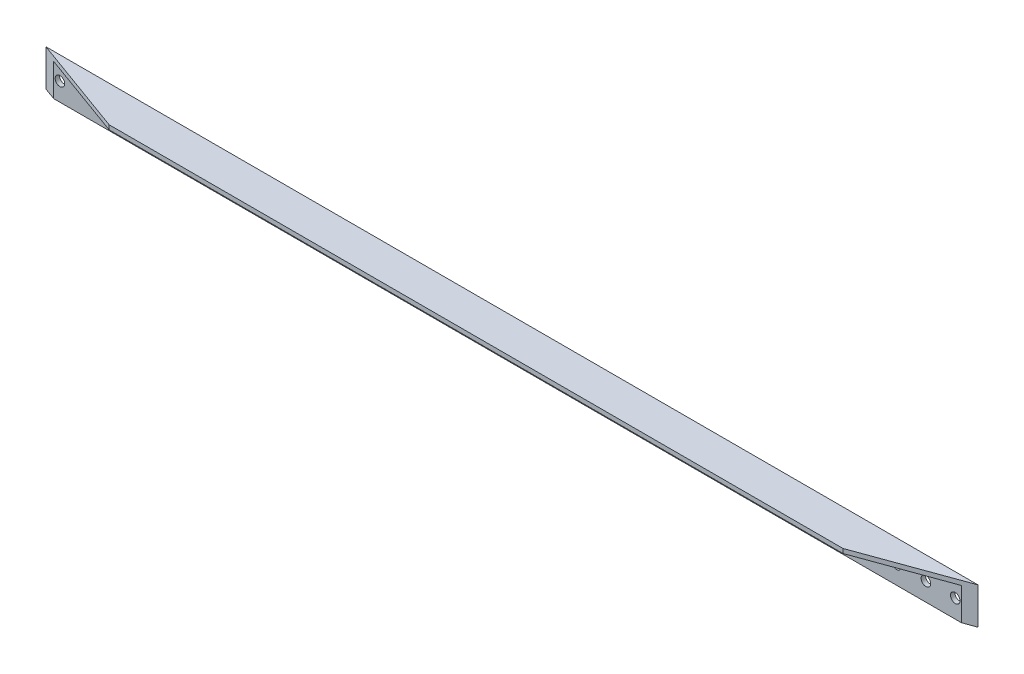
ISO-10303-21;
HEADER;
FILE_DESCRIPTION(('STEP AP214'),'2;1');
FILE_NAME('part.step','',(''),(''),'','','');
FILE_SCHEMA(('AUTOMOTIVE_DESIGN { 1 0 10303 214 1 1 1 1 }'));
ENDSEC;
DATA;
#1=APPLICATION_CONTEXT('core data for automotive mechanical design processes');
#2=APPLICATION_PROTOCOL_DEFINITION('international standard','automotive_design',2000,#1);
#3=PRODUCT_CONTEXT('',#1,'mechanical');
#4=PRODUCT('Part','Part','',(#3));
#5=PRODUCT_RELATED_PRODUCT_CATEGORY('part','',(#4));
#6=PRODUCT_DEFINITION_FORMATION('','',#4);
#7=PRODUCT_DEFINITION_CONTEXT('part definition',#1,'design');
#8=PRODUCT_DEFINITION('design','',#6,#7);
#9=PRODUCT_DEFINITION_SHAPE('','',#8);
#10=(LENGTH_UNIT() NAMED_UNIT(*) SI_UNIT(.MILLI.,.METRE.));
#11=(NAMED_UNIT(*) PLANE_ANGLE_UNIT() SI_UNIT($,.RADIAN.));
#12=(NAMED_UNIT(*) SI_UNIT($,.STERADIAN.) SOLID_ANGLE_UNIT());
#13=UNCERTAINTY_MEASURE_WITH_UNIT(LENGTH_MEASURE(1.E-05),#10,'distance_accuracy_value','');
#14=(GEOMETRIC_REPRESENTATION_CONTEXT(3) GLOBAL_UNCERTAINTY_ASSIGNED_CONTEXT((#13)) GLOBAL_UNIT_ASSIGNED_CONTEXT((#10,
#11,#12)) REPRESENTATION_CONTEXT('',''));
#15=CARTESIAN_POINT('',(0.,0.,0.));
#16=DIRECTION('',(0.,0.,1.));
#17=DIRECTION('',(1.,0.,0.));
#18=AXIS2_PLACEMENT_3D('',#15,#16,#17);
#19=CARTESIAN_POINT('',(-1270.,-50.,12.));
#20=DIRECTION('',(0.,0.,1.));
#21=DIRECTION('',(1.,0.,0.));
#22=AXIS2_PLACEMENT_3D('',#19,#20,#21);
#23=PLANE('',#22);
#24=DIRECTION('',(0.,1.,0.));
#25=VECTOR('',#24,1.);
#26=CARTESIAN_POINT('',(-1236.9387755102,-50.,12.));
#27=LINE('',#26,#25);
#28=CARTESIAN_POINT('',(-1236.9387755102,-50.,12.));
#29=VERTEX_POINT('',#28);
#30=CARTESIAN_POINT('',(-1236.9387755102,38.,12.));
#31=VERTEX_POINT('',#30);
#32=EDGE_CURVE('E249',#29,#31,#27,.T.);
#33=ORIENTED_EDGE('',*,*,#32,.F.);
#34=DIRECTION('',(1.,0.,0.));
#35=VECTOR('',#34,1.);
#36=CARTESIAN_POINT('',(-1270.,-50.,12.));
#37=LINE('',#36,#35);
#38=CARTESIAN_POINT('',(1236.9387755102,-50.,12.));
#39=VERTEX_POINT('',#38);
#40=EDGE_CURVE('E215',#29,#39,#37,.T.);
#41=ORIENTED_EDGE('',*,*,#40,.T.);
#42=DIRECTION('',(0.,-1.,0.));
#43=VECTOR('',#42,1.);
#44=CARTESIAN_POINT('',(1236.9387755102,-50.,12.));
#45=LINE('',#44,#43);
#46=CARTESIAN_POINT('',(1236.9387755102,38.,11.9999999999999));
#47=VERTEX_POINT('',#46);
#48=EDGE_CURVE('E233',#47,#39,#45,.T.);
#49=ORIENTED_EDGE('',*,*,#48,.F.);
#50=DIRECTION('',(1.,0.,0.));
#51=VECTOR('',#50,1.);
#52=CARTESIAN_POINT('',(-1270.,38.,12.));
#53=LINE('',#52,#51);
#54=EDGE_CURVE('E36',#31,#47,#53,.T.);
#55=ORIENTED_EDGE('',*,*,#54,.F.);
#56=EDGE_LOOP('',(#33,#41,#49,#55));
#57=FACE_BOUND('',#56,.T.);
#58=CARTESIAN_POINT('',(-1140.,0.,12.));
#59=DIRECTION('',(0.,0.,1.));
#60=DIRECTION('',(-1.,0.,0.));
#61=AXIS2_PLACEMENT_3D('',#58,#59,#60);
#62=CIRCLE('',#61,12.9999999999998);
#63=CARTESIAN_POINT('',(-1153.,0.,12.));
#64=VERTEX_POINT('',#63);
#65=EDGE_CURVE('E113',#64,#64,#62,.T.);
#66=ORIENTED_EDGE('',*,*,#65,.F.);
#67=EDGE_LOOP('',(#66));
#68=FACE_BOUND('',#67,.T.);
#69=CARTESIAN_POINT('',(-979.999999999999,0.,12.));
#70=DIRECTION('',(0.,0.,1.));
#71=DIRECTION('',(-1.,0.,0.));
#72=AXIS2_PLACEMENT_3D('',#69,#70,#71);
#73=CIRCLE('',#72,13.);
#74=CARTESIAN_POINT('',(-992.999999999999,0.,12.));
#75=VERTEX_POINT('',#74);
#76=EDGE_CURVE('E125',#75,#75,#73,.T.);
#77=ORIENTED_EDGE('',*,*,#76,.F.);
#78=EDGE_LOOP('',(#77));
#79=FACE_BOUND('',#78,.T.);
#80=CARTESIAN_POINT('',(-459.999999999999,0.,12.));
#81=DIRECTION('',(0.,0.,1.));
#82=DIRECTION('',(-1.,0.,0.));
#83=AXIS2_PLACEMENT_3D('',#80,#81,#82);
#84=CIRCLE('',#83,13.);
#85=CARTESIAN_POINT('',(-472.999999999999,0.,12.));
#86=VERTEX_POINT('',#85);
#87=EDGE_CURVE('E137',#86,#86,#84,.T.);
#88=ORIENTED_EDGE('',*,*,#87,.F.);
#89=EDGE_LOOP('',(#88));
#90=FACE_BOUND('',#89,.T.);
#91=CARTESIAN_POINT('',(-299.999999999999,0.,12.));
#92=DIRECTION('',(0.,0.,1.));
#93=DIRECTION('',(-1.,0.,0.));
#94=AXIS2_PLACEMENT_3D('',#91,#92,#93);
#95=CIRCLE('',#94,13.);
#96=CARTESIAN_POINT('',(-312.999999999999,0.,12.));
#97=VERTEX_POINT('',#96);
#98=EDGE_CURVE('E149',#97,#97,#95,.T.);
#99=ORIENTED_EDGE('',*,*,#98,.F.);
#100=EDGE_LOOP('',(#99));
#101=FACE_BOUND('',#100,.T.);
#102=CARTESIAN_POINT('',(179.999999999999,0.,12.));
#103=DIRECTION('',(0.,0.,1.));
#104=DIRECTION('',(1.,0.,0.));
#105=AXIS2_PLACEMENT_3D('',#102,#103,#104);
#106=CIRCLE('',#105,13.);
#107=CARTESIAN_POINT('',(192.999999999999,0.,12.));
#108=VERTEX_POINT('',#107);
#109=EDGE_CURVE('E161',#108,#108,#106,.T.);
#110=ORIENTED_EDGE('',*,*,#109,.F.);
#111=EDGE_LOOP('',(#110));
#112=FACE_BOUND('',#111,.T.);
#113=CARTESIAN_POINT('',(379.999999999999,0.,12.));
#114=DIRECTION('',(0.,0.,1.));
#115=DIRECTION('',(1.,0.,0.));
#116=AXIS2_PLACEMENT_3D('',#113,#114,#115);
#117=CIRCLE('',#116,13.);
#118=CARTESIAN_POINT('',(392.999999999999,0.,12.));
#119=VERTEX_POINT('',#118);
#120=EDGE_CURVE('E173',#119,#119,#117,.T.);
#121=ORIENTED_EDGE('',*,*,#120,.F.);
#122=EDGE_LOOP('',(#121));
#123=FACE_BOUND('',#122,.T.);
#124=CARTESIAN_POINT('',(579.999999999999,0.,12.));
#125=DIRECTION('',(0.,0.,1.));
#126=DIRECTION('',(1.,0.,0.));
#127=AXIS2_PLACEMENT_3D('',#124,#125,#126);
#128=CIRCLE('',#127,13.);
#129=CARTESIAN_POINT('',(592.999999999999,0.,12.));
#130=VERTEX_POINT('',#129);
#131=EDGE_CURVE('E185',#130,#130,#128,.T.);
#132=ORIENTED_EDGE('',*,*,#131,.F.);
#133=EDGE_LOOP('',(#132));
#134=FACE_BOUND('',#133,.T.);
#135=CARTESIAN_POINT('',(1060.,0.,12.));
#136=DIRECTION('',(0.,0.,1.));
#137=DIRECTION('',(1.,0.,0.));
#138=AXIS2_PLACEMENT_3D('',#135,#136,#137);
#139=CIRCLE('',#138,12.9999999999998);
#140=CARTESIAN_POINT('',(1073.,0.,12.));
#141=VERTEX_POINT('',#140);
#142=EDGE_CURVE('E197',#141,#141,#139,.T.);
#143=ORIENTED_EDGE('',*,*,#142,.F.);
#144=EDGE_LOOP('',(#143));
#145=FACE_BOUND('',#144,.T.);
#146=CARTESIAN_POINT('',(1220.,0.,12.));
#147=DIRECTION('',(0.,0.,1.));
#148=DIRECTION('',(1.,0.,0.));
#149=AXIS2_PLACEMENT_3D('',#146,#147,#148);
#150=CIRCLE('',#149,12.9999999999998);
#151=CARTESIAN_POINT('',(1233.,0.,12.));
#152=VERTEX_POINT('',#151);
#153=EDGE_CURVE('E209',#152,#152,#150,.T.);
#154=ORIENTED_EDGE('',*,*,#153,.F.);
#155=EDGE_LOOP('',(#154));
#156=FACE_BOUND('',#155,.T.);
#157=CARTESIAN_POINT('',(1140.,0.,12.));
#158=DIRECTION('',(0.,0.,1.));
#159=DIRECTION('',(1.,0.,0.));
#160=AXIS2_PLACEMENT_3D('',#157,#158,#159);
#161=CIRCLE('',#160,12.9999999999998);
#162=CARTESIAN_POINT('',(1153.,0.,12.));
#163=VERTEX_POINT('',#162);
#164=EDGE_CURVE('E203',#163,#163,#161,.T.);
#165=ORIENTED_EDGE('',*,*,#164,.F.);
#166=EDGE_LOOP('',(#165));
#167=FACE_BOUND('',#166,.T.);
#168=CARTESIAN_POINT('',(979.999999999999,0.,12.));
#169=DIRECTION('',(0.,0.,1.));
#170=DIRECTION('',(1.,0.,0.));
#171=AXIS2_PLACEMENT_3D('',#168,#169,#170);
#172=CIRCLE('',#171,13.);
#173=CARTESIAN_POINT('',(992.999999999999,0.,12.));
#174=VERTEX_POINT('',#173);
#175=EDGE_CURVE('E191',#174,#174,#172,.T.);
#176=ORIENTED_EDGE('',*,*,#175,.F.);
#177=EDGE_LOOP('',(#176));
#178=FACE_BOUND('',#177,.T.);
#179=CARTESIAN_POINT('',(459.999999999999,0.,12.));
#180=DIRECTION('',(0.,0.,1.));
#181=DIRECTION('',(1.,0.,0.));
#182=AXIS2_PLACEMENT_3D('',#179,#180,#181);
#183=CIRCLE('',#182,13.);
#184=CARTESIAN_POINT('',(472.999999999999,0.,12.));
#185=VERTEX_POINT('',#184);
#186=EDGE_CURVE('E179',#185,#185,#183,.T.);
#187=ORIENTED_EDGE('',*,*,#186,.F.);
#188=EDGE_LOOP('',(#187));
#189=FACE_BOUND('',#188,.T.);
#190=CARTESIAN_POINT('',(299.999999999999,0.,12.));
#191=DIRECTION('',(0.,0.,1.));
#192=DIRECTION('',(1.,0.,0.));
#193=AXIS2_PLACEMENT_3D('',#190,#191,#192);
#194=CIRCLE('',#193,13.);
#195=CARTESIAN_POINT('',(312.999999999999,0.,12.));
#196=VERTEX_POINT('',#195);
#197=EDGE_CURVE('E167',#196,#196,#194,.T.);
#198=ORIENTED_EDGE('',*,*,#197,.F.);
#199=EDGE_LOOP('',(#198));
#200=FACE_BOUND('',#199,.T.);
#201=CARTESIAN_POINT('',(-179.999999999999,0.,12.));
#202=DIRECTION('',(0.,0.,1.));
#203=DIRECTION('',(-1.,0.,0.));
#204=AXIS2_PLACEMENT_3D('',#201,#202,#203);
#205=CIRCLE('',#204,13.);
#206=CARTESIAN_POINT('',(-192.999999999999,0.,12.));
#207=VERTEX_POINT('',#206);
#208=EDGE_CURVE('E155',#207,#207,#205,.T.);
#209=ORIENTED_EDGE('',*,*,#208,.F.);
#210=EDGE_LOOP('',(#209));
#211=FACE_BOUND('',#210,.T.);
#212=CARTESIAN_POINT('',(-379.999999999999,0.,12.));
#213=DIRECTION('',(0.,0.,1.));
#214=DIRECTION('',(-1.,0.,0.));
#215=AXIS2_PLACEMENT_3D('',#212,#213,#214);
#216=CIRCLE('',#215,13.);
#217=CARTESIAN_POINT('',(-392.999999999999,0.,12.));
#218=VERTEX_POINT('',#217);
#219=EDGE_CURVE('E143',#218,#218,#216,.T.);
#220=ORIENTED_EDGE('',*,*,#219,.F.);
#221=EDGE_LOOP('',(#220));
#222=FACE_BOUND('',#221,.T.);
#223=CARTESIAN_POINT('',(-579.999999999999,0.,12.));
#224=DIRECTION('',(0.,0.,1.));
#225=DIRECTION('',(-1.,0.,0.));
#226=AXIS2_PLACEMENT_3D('',#223,#224,#225);
#227=CIRCLE('',#226,13.);
#228=CARTESIAN_POINT('',(-592.999999999999,0.,12.));
#229=VERTEX_POINT('',#228);
#230=EDGE_CURVE('E131',#229,#229,#227,.T.);
#231=ORIENTED_EDGE('',*,*,#230,.F.);
#232=EDGE_LOOP('',(#231));
#233=FACE_BOUND('',#232,.T.);
#234=CARTESIAN_POINT('',(-1060.,0.,12.));
#235=DIRECTION('',(0.,0.,1.));
#236=DIRECTION('',(-1.,0.,0.));
#237=AXIS2_PLACEMENT_3D('',#234,#235,#236);
#238=CIRCLE('',#237,12.9999999999998);
#239=CARTESIAN_POINT('',(-1073.,0.,12.));
#240=VERTEX_POINT('',#239);
#241=EDGE_CURVE('E119',#240,#240,#238,.T.);
#242=ORIENTED_EDGE('',*,*,#241,.F.);
#243=EDGE_LOOP('',(#242));
#244=FACE_BOUND('',#243,.T.);
#245=CARTESIAN_POINT('',(-1220.,0.,12.));
#246=DIRECTION('',(0.,0.,1.));
#247=DIRECTION('',(-1.,0.,0.));
#248=AXIS2_PLACEMENT_3D('',#245,#246,#247);
#249=CIRCLE('',#248,12.9999999999998);
#250=CARTESIAN_POINT('',(-1233.,0.,12.));
#251=VERTEX_POINT('',#250);
#252=EDGE_CURVE('E104',#251,#251,#249,.T.);
#253=ORIENTED_EDGE('',*,*,#252,.F.);
#254=EDGE_LOOP('',(#253));
#255=FACE_BOUND('',#254,.T.);
#256=ADVANCED_FACE('F32',(#57,#68,#79,#90,#101,#112,#123,#134,#145,#156,#167,#178,#189,#200,
#211,#222,#233,#244,#255),#23,.T.);
#257=CARTESIAN_POINT('',(-1270.,-50.,0.));
#258=DIRECTION('',(0.,0.,1.));
#259=DIRECTION('',(1.,0.,0.));
#260=AXIS2_PLACEMENT_3D('',#257,#258,#259);
#261=PLANE('',#260);
#262=CARTESIAN_POINT('',(-1140.,0.,0.));
#263=DIRECTION('',(0.,0.,1.));
#264=DIRECTION('',(-1.,0.,0.));
#265=AXIS2_PLACEMENT_3D('',#262,#263,#264);
#266=CIRCLE('',#265,12.9999999999998);
#267=CARTESIAN_POINT('',(-1153.,0.,0.));
#268=VERTEX_POINT('',#267);
#269=EDGE_CURVE('E111',#268,#268,#266,.T.);
#270=ORIENTED_EDGE('',*,*,#269,.T.);
#271=EDGE_LOOP('',(#270));
#272=FACE_BOUND('',#271,.T.);
#273=CARTESIAN_POINT('',(-979.999999999999,0.,0.));
#274=DIRECTION('',(0.,0.,1.));
#275=DIRECTION('',(-1.,0.,0.));
#276=AXIS2_PLACEMENT_3D('',#273,#274,#275);
#277=CIRCLE('',#276,13.);
#278=CARTESIAN_POINT('',(-992.999999999999,0.,0.));
#279=VERTEX_POINT('',#278);
#280=EDGE_CURVE('E122',#279,#279,#277,.T.);
#281=ORIENTED_EDGE('',*,*,#280,.T.);
#282=EDGE_LOOP('',(#281));
#283=FACE_BOUND('',#282,.T.);
#284=CARTESIAN_POINT('',(-459.999999999999,0.,0.));
#285=DIRECTION('',(0.,0.,1.));
#286=DIRECTION('',(-1.,0.,0.));
#287=AXIS2_PLACEMENT_3D('',#284,#285,#286);
#288=CIRCLE('',#287,13.);
#289=CARTESIAN_POINT('',(-472.999999999999,0.,0.));
#290=VERTEX_POINT('',#289);
#291=EDGE_CURVE('E134',#290,#290,#288,.T.);
#292=ORIENTED_EDGE('',*,*,#291,.T.);
#293=EDGE_LOOP('',(#292));
#294=FACE_BOUND('',#293,.T.);
#295=CARTESIAN_POINT('',(-299.999999999999,0.,0.));
#296=DIRECTION('',(0.,0.,1.));
#297=DIRECTION('',(-1.,0.,0.));
#298=AXIS2_PLACEMENT_3D('',#295,#296,#297);
#299=CIRCLE('',#298,13.);
#300=CARTESIAN_POINT('',(-312.999999999999,0.,0.));
#301=VERTEX_POINT('',#300);
#302=EDGE_CURVE('E146',#301,#301,#299,.T.);
#303=ORIENTED_EDGE('',*,*,#302,.T.);
#304=EDGE_LOOP('',(#303));
#305=FACE_BOUND('',#304,.T.);
#306=CARTESIAN_POINT('',(179.999999999999,0.,0.));
#307=DIRECTION('',(0.,0.,1.));
#308=DIRECTION('',(1.,0.,0.));
#309=AXIS2_PLACEMENT_3D('',#306,#307,#308);
#310=CIRCLE('',#309,13.);
#311=CARTESIAN_POINT('',(192.999999999999,0.,0.));
#312=VERTEX_POINT('',#311);
#313=EDGE_CURVE('E158',#312,#312,#310,.T.);
#314=ORIENTED_EDGE('',*,*,#313,.T.);
#315=EDGE_LOOP('',(#314));
#316=FACE_BOUND('',#315,.T.);
#317=CARTESIAN_POINT('',(379.999999999999,0.,0.));
#318=DIRECTION('',(0.,0.,1.));
#319=DIRECTION('',(1.,0.,0.));
#320=AXIS2_PLACEMENT_3D('',#317,#318,#319);
#321=CIRCLE('',#320,13.);
#322=CARTESIAN_POINT('',(392.999999999999,0.,0.));
#323=VERTEX_POINT('',#322);
#324=EDGE_CURVE('E170',#323,#323,#321,.T.);
#325=ORIENTED_EDGE('',*,*,#324,.T.);
#326=EDGE_LOOP('',(#325));
#327=FACE_BOUND('',#326,.T.);
#328=CARTESIAN_POINT('',(579.999999999999,0.,0.));
#329=DIRECTION('',(0.,0.,1.));
#330=DIRECTION('',(1.,0.,0.));
#331=AXIS2_PLACEMENT_3D('',#328,#329,#330);
#332=CIRCLE('',#331,13.);
#333=CARTESIAN_POINT('',(592.999999999999,0.,0.));
#334=VERTEX_POINT('',#333);
#335=EDGE_CURVE('E182',#334,#334,#332,.T.);
#336=ORIENTED_EDGE('',*,*,#335,.T.);
#337=EDGE_LOOP('',(#336));
#338=FACE_BOUND('',#337,.T.);
#339=CARTESIAN_POINT('',(1060.,0.,0.));
#340=DIRECTION('',(0.,0.,1.));
#341=DIRECTION('',(1.,0.,0.));
#342=AXIS2_PLACEMENT_3D('',#339,#340,#341);
#343=CIRCLE('',#342,12.9999999999998);
#344=CARTESIAN_POINT('',(1073.,0.,0.));
#345=VERTEX_POINT('',#344);
#346=EDGE_CURVE('E194',#345,#345,#343,.T.);
#347=ORIENTED_EDGE('',*,*,#346,.T.);
#348=EDGE_LOOP('',(#347));
#349=FACE_BOUND('',#348,.T.);
#350=CARTESIAN_POINT('',(1220.,0.,0.));
#351=DIRECTION('',(0.,0.,1.));
#352=DIRECTION('',(1.,0.,0.));
#353=AXIS2_PLACEMENT_3D('',#350,#351,#352);
#354=CIRCLE('',#353,12.9999999999998);
#355=CARTESIAN_POINT('',(1233.,0.,0.));
#356=VERTEX_POINT('',#355);
#357=EDGE_CURVE('E206',#356,#356,#354,.T.);
#358=ORIENTED_EDGE('',*,*,#357,.T.);
#359=EDGE_LOOP('',(#358));
#360=FACE_BOUND('',#359,.T.);
#361=DIRECTION('',(0.,-1.,0.));
#362=VECTOR('',#361,1.);
#363=CARTESIAN_POINT('',(-1270.,50.,0.));
#364=LINE('',#363,#362);
#365=CARTESIAN_POINT('',(-1270.,50.,0.));
#366=VERTEX_POINT('',#365);
#367=CARTESIAN_POINT('',(-1270.,-50.,0.));
#368=VERTEX_POINT('',#367);
#369=EDGE_CURVE('E212',#366,#368,#364,.T.);
#370=ORIENTED_EDGE('',*,*,#369,.F.);
#371=DIRECTION('',(-1.,0.,0.));
#372=VECTOR('',#371,1.);
#373=CARTESIAN_POINT('',(-1270.,50.,0.));
#374=LINE('',#373,#372);
#375=CARTESIAN_POINT('',(1270.,50.,0.));
#376=VERTEX_POINT('',#375);
#377=EDGE_CURVE('E96',#376,#366,#374,.T.);
#378=ORIENTED_EDGE('',*,*,#377,.F.);
#379=DIRECTION('',(0.,1.,0.));
#380=VECTOR('',#379,1.);
#381=CARTESIAN_POINT('',(1270.,50.,0.));
#382=LINE('',#381,#380);
#383=CARTESIAN_POINT('',(1270.,-50.,0.));
#384=VERTEX_POINT('',#383);
#385=EDGE_CURVE('E221',#384,#376,#382,.T.);
#386=ORIENTED_EDGE('',*,*,#385,.F.);
#387=DIRECTION('',(1.,0.,0.));
#388=VECTOR('',#387,1.);
#389=CARTESIAN_POINT('',(-1270.,-50.,0.));
#390=LINE('',#389,#388);
#391=EDGE_CURVE('E218',#368,#384,#390,.T.);
#392=ORIENTED_EDGE('',*,*,#391,.F.);
#393=EDGE_LOOP('',(#370,#378,#386,#392));
#394=FACE_BOUND('',#393,.T.);
#395=CARTESIAN_POINT('',(1140.,0.,0.));
#396=DIRECTION('',(0.,0.,1.));
#397=DIRECTION('',(1.,0.,0.));
#398=AXIS2_PLACEMENT_3D('',#395,#396,#397);
#399=CIRCLE('',#398,12.9999999999998);
#400=CARTESIAN_POINT('',(1153.,0.,0.));
#401=VERTEX_POINT('',#400);
#402=EDGE_CURVE('E200',#401,#401,#399,.T.);
#403=ORIENTED_EDGE('',*,*,#402,.T.);
#404=EDGE_LOOP('',(#403));
#405=FACE_BOUND('',#404,.T.);
#406=CARTESIAN_POINT('',(979.999999999999,0.,0.));
#407=DIRECTION('',(0.,0.,1.));
#408=DIRECTION('',(1.,0.,0.));
#409=AXIS2_PLACEMENT_3D('',#406,#407,#408);
#410=CIRCLE('',#409,13.);
#411=CARTESIAN_POINT('',(992.999999999999,0.,0.));
#412=VERTEX_POINT('',#411);
#413=EDGE_CURVE('E188',#412,#412,#410,.T.);
#414=ORIENTED_EDGE('',*,*,#413,.T.);
#415=EDGE_LOOP('',(#414));
#416=FACE_BOUND('',#415,.T.);
#417=CARTESIAN_POINT('',(459.999999999999,0.,0.));
#418=DIRECTION('',(0.,0.,1.));
#419=DIRECTION('',(1.,0.,0.));
#420=AXIS2_PLACEMENT_3D('',#417,#418,#419);
#421=CIRCLE('',#420,13.);
#422=CARTESIAN_POINT('',(472.999999999999,0.,0.));
#423=VERTEX_POINT('',#422);
#424=EDGE_CURVE('E176',#423,#423,#421,.T.);
#425=ORIENTED_EDGE('',*,*,#424,.T.);
#426=EDGE_LOOP('',(#425));
#427=FACE_BOUND('',#426,.T.);
#428=CARTESIAN_POINT('',(299.999999999999,0.,0.));
#429=DIRECTION('',(0.,0.,1.));
#430=DIRECTION('',(1.,0.,0.));
#431=AXIS2_PLACEMENT_3D('',#428,#429,#430);
#432=CIRCLE('',#431,13.);
#433=CARTESIAN_POINT('',(312.999999999999,0.,0.));
#434=VERTEX_POINT('',#433);
#435=EDGE_CURVE('E164',#434,#434,#432,.T.);
#436=ORIENTED_EDGE('',*,*,#435,.T.);
#437=EDGE_LOOP('',(#436));
#438=FACE_BOUND('',#437,.T.);
#439=CARTESIAN_POINT('',(-179.999999999999,0.,0.));
#440=DIRECTION('',(0.,0.,1.));
#441=DIRECTION('',(-1.,0.,0.));
#442=AXIS2_PLACEMENT_3D('',#439,#440,#441);
#443=CIRCLE('',#442,13.);
#444=CARTESIAN_POINT('',(-192.999999999999,0.,0.));
#445=VERTEX_POINT('',#444);
#446=EDGE_CURVE('E152',#445,#445,#443,.T.);
#447=ORIENTED_EDGE('',*,*,#446,.T.);
#448=EDGE_LOOP('',(#447));
#449=FACE_BOUND('',#448,.T.);
#450=CARTESIAN_POINT('',(-379.999999999999,0.,0.));
#451=DIRECTION('',(0.,0.,1.));
#452=DIRECTION('',(-1.,0.,0.));
#453=AXIS2_PLACEMENT_3D('',#450,#451,#452);
#454=CIRCLE('',#453,13.);
#455=CARTESIAN_POINT('',(-392.999999999999,0.,0.));
#456=VERTEX_POINT('',#455);
#457=EDGE_CURVE('E140',#456,#456,#454,.T.);
#458=ORIENTED_EDGE('',*,*,#457,.T.);
#459=EDGE_LOOP('',(#458));
#460=FACE_BOUND('',#459,.T.);
#461=CARTESIAN_POINT('',(-579.999999999999,0.,0.));
#462=DIRECTION('',(0.,0.,1.));
#463=DIRECTION('',(-1.,0.,0.));
#464=AXIS2_PLACEMENT_3D('',#461,#462,#463);
#465=CIRCLE('',#464,13.);
#466=CARTESIAN_POINT('',(-592.999999999999,0.,0.));
#467=VERTEX_POINT('',#466);
#468=EDGE_CURVE('E128',#467,#467,#465,.T.);
#469=ORIENTED_EDGE('',*,*,#468,.T.);
#470=EDGE_LOOP('',(#469));
#471=FACE_BOUND('',#470,.T.);
#472=CARTESIAN_POINT('',(-1060.,0.,0.));
#473=DIRECTION('',(0.,0.,1.));
#474=DIRECTION('',(-1.,0.,0.));
#475=AXIS2_PLACEMENT_3D('',#472,#473,#474);
#476=CIRCLE('',#475,12.9999999999998);
#477=CARTESIAN_POINT('',(-1073.,0.,0.));
#478=VERTEX_POINT('',#477);
#479=EDGE_CURVE('E116',#478,#478,#476,.T.);
#480=ORIENTED_EDGE('',*,*,#479,.T.);
#481=EDGE_LOOP('',(#480));
#482=FACE_BOUND('',#481,.T.);
#483=CARTESIAN_POINT('',(-1220.,0.,0.));
#484=DIRECTION('',(0.,0.,1.));
#485=DIRECTION('',(-1.,0.,0.));
#486=AXIS2_PLACEMENT_3D('',#483,#484,#485);
#487=CIRCLE('',#486,12.9999999999998);
#488=CARTESIAN_POINT('',(-1233.,0.,0.));
#489=VERTEX_POINT('',#488);
#490=EDGE_CURVE('E100',#489,#489,#487,.T.);
#491=ORIENTED_EDGE('',*,*,#490,.T.);
#492=EDGE_LOOP('',(#491));
#493=FACE_BOUND('',#492,.T.);
#494=ADVANCED_FACE('F253',(#272,#283,#294,#305,#316,#327,#338,#349,#360,#394,#405,#416,#427,
#438,#449,#460,#471,#482,#493),#261,.F.);
#495=CARTESIAN_POINT('',(-1270.,-50.,12.));
#496=DIRECTION('',(0.,1.,0.));
#497=DIRECTION('',(0.,0.,1.));
#498=AXIS2_PLACEMENT_3D('',#495,#496,#497);
#499=PLANE('',#498);
#500=ORIENTED_EDGE('',*,*,#40,.F.);
#501=DIRECTION('',(-0.939996554641713,0.,-0.341183934647733));
#502=VECTOR('',#501,1.);
#503=CARTESIAN_POINT('',(-1266.15145932318,-50.,1.39687772714057));
#504=LINE('',#503,#502);
#505=EDGE_CURVE('E237',#29,#368,#504,.T.);
#506=ORIENTED_EDGE('',*,*,#505,.T.);
#507=ORIENTED_EDGE('',*,*,#391,.T.);
#508=DIRECTION('',(-0.939996554641713,0.,0.341183934647733));
#509=VECTOR('',#508,1.);
#510=CARTESIAN_POINT('',(-978.176088432076,-50.,816.004654319791));
#511=LINE('',#510,#509);
#512=EDGE_CURVE('E235',#384,#39,#511,.T.);
#513=ORIENTED_EDGE('',*,*,#512,.T.);
#514=EDGE_LOOP('',(#500,#506,#507,#513));
#515=FACE_BOUND('',#514,.T.);
#516=ADVANCED_FACE('F34',(#515),#499,.F.);
#517=CARTESIAN_POINT('',(-1270.,50.,12.));
#518=DIRECTION('',(0.,-1.,0.));
#519=DIRECTION('',(0.,0.,-1.));
#520=AXIS2_PLACEMENT_3D('',#517,#518,#519);
#521=PLANE('',#520);
#522=ORIENTED_EDGE('',*,*,#377,.T.);
#523=DIRECTION('',(-0.939996554641713,0.,-0.341183934647733));
#524=VECTOR('',#523,1.);
#525=CARTESIAN_POINT('',(-1270.,50.,0.));
#526=LINE('',#525,#524);
#527=CARTESIAN_POINT('',(-1000.,50.,98.));
#528=VERTEX_POINT('',#527);
#529=EDGE_CURVE('E86',#528,#366,#526,.T.);
#530=ORIENTED_EDGE('',*,*,#529,.F.);
#531=DIRECTION('',(-1.,0.,0.));
#532=VECTOR('',#531,1.);
#533=CARTESIAN_POINT('',(-1270.,50.,98.));
#534=LINE('',#533,#532);
#535=CARTESIAN_POINT('',(999.999999999999,50.,98.));
#536=VERTEX_POINT('',#535);
#537=EDGE_CURVE('E94',#536,#528,#534,.T.);
#538=ORIENTED_EDGE('',*,*,#537,.F.);
#539=DIRECTION('',(-0.939996554641713,0.,0.341183934647733));
#540=VECTOR('',#539,1.);
#541=CARTESIAN_POINT('',(1270.,50.,0.));
#542=LINE('',#541,#540);
#543=EDGE_CURVE('E56',#376,#536,#542,.T.);
#544=ORIENTED_EDGE('',*,*,#543,.F.);
#545=EDGE_LOOP('',(#522,#530,#538,#544));
#546=FACE_BOUND('',#545,.T.);
#547=ADVANCED_FACE('F93',(#546),#521,.F.);
#548=CARTESIAN_POINT('',(1220.,0.,12.));
#549=DIRECTION('',(0.,0.,-1.));
#550=DIRECTION('',(-1.,0.,0.));
#551=AXIS2_PLACEMENT_3D('',#548,#549,#550);
#552=CYLINDRICAL_SURFACE('',#551,12.9999999999998);
#553=ORIENTED_EDGE('',*,*,#153,.T.);
#554=EDGE_LOOP('',(#553));
#555=FACE_BOUND('',#554,.T.);
#556=ORIENTED_EDGE('',*,*,#357,.F.);
#557=EDGE_LOOP('',(#556));
#558=FACE_BOUND('',#557,.T.);
#559=ADVANCED_FACE('F294',(#555,#558),#552,.F.);
#560=CARTESIAN_POINT('',(1140.,0.,12.));
#561=DIRECTION('',(0.,0.,-1.));
#562=DIRECTION('',(-1.,0.,0.));
#563=AXIS2_PLACEMENT_3D('',#560,#561,#562);
#564=CYLINDRICAL_SURFACE('',#563,12.9999999999998);
#565=ORIENTED_EDGE('',*,*,#164,.T.);
#566=EDGE_LOOP('',(#565));
#567=FACE_BOUND('',#566,.T.);
#568=ORIENTED_EDGE('',*,*,#402,.F.);
#569=EDGE_LOOP('',(#568));
#570=FACE_BOUND('',#569,.T.);
#571=ADVANCED_FACE('F301',(#567,#570),#564,.F.);
#572=CARTESIAN_POINT('',(1060.,0.,12.));
#573=DIRECTION('',(0.,0.,-1.));
#574=DIRECTION('',(-1.,0.,0.));
#575=AXIS2_PLACEMENT_3D('',#572,#573,#574);
#576=CYLINDRICAL_SURFACE('',#575,12.9999999999998);
#577=ORIENTED_EDGE('',*,*,#142,.T.);
#578=EDGE_LOOP('',(#577));
#579=FACE_BOUND('',#578,.T.);
#580=ORIENTED_EDGE('',*,*,#346,.F.);
#581=EDGE_LOOP('',(#580));
#582=FACE_BOUND('',#581,.T.);
#583=ADVANCED_FACE('F453',(#579,#582),#576,.F.);
#584=CARTESIAN_POINT('',(979.999999999999,0.,12.));
#585=DIRECTION('',(0.,0.,-1.));
#586=DIRECTION('',(-1.,0.,0.));
#587=AXIS2_PLACEMENT_3D('',#584,#585,#586);
#588=CYLINDRICAL_SURFACE('',#587,13.);
#589=ORIENTED_EDGE('',*,*,#175,.T.);
#590=EDGE_LOOP('',(#589));
#591=FACE_BOUND('',#590,.T.);
#592=ORIENTED_EDGE('',*,*,#413,.F.);
#593=EDGE_LOOP('',(#592));
#594=FACE_BOUND('',#593,.T.);
#595=ADVANCED_FACE('F443',(#591,#594),#588,.F.);
#596=CARTESIAN_POINT('',(579.999999999999,0.,12.));
#597=DIRECTION('',(0.,0.,-1.));
#598=DIRECTION('',(-1.,0.,0.));
#599=AXIS2_PLACEMENT_3D('',#596,#597,#598);
#600=CYLINDRICAL_SURFACE('',#599,13.);
#601=ORIENTED_EDGE('',*,*,#131,.T.);
#602=EDGE_LOOP('',(#601));
#603=FACE_BOUND('',#602,.T.);
#604=ORIENTED_EDGE('',*,*,#335,.F.);
#605=EDGE_LOOP('',(#604));
#606=FACE_BOUND('',#605,.T.);
#607=ADVANCED_FACE('F433',(#603,#606),#600,.F.);
#608=CARTESIAN_POINT('',(459.999999999999,0.,12.));
#609=DIRECTION('',(0.,0.,-1.));
#610=DIRECTION('',(-1.,0.,0.));
#611=AXIS2_PLACEMENT_3D('',#608,#609,#610);
#612=CYLINDRICAL_SURFACE('',#611,13.);
#613=ORIENTED_EDGE('',*,*,#186,.T.);
#614=EDGE_LOOP('',(#613));
#615=FACE_BOUND('',#614,.T.);
#616=ORIENTED_EDGE('',*,*,#424,.F.);
#617=EDGE_LOOP('',(#616));
#618=FACE_BOUND('',#617,.T.);
#619=ADVANCED_FACE('F423',(#615,#618),#612,.F.);
#620=CARTESIAN_POINT('',(379.999999999999,0.,12.));
#621=DIRECTION('',(0.,0.,-1.));
#622=DIRECTION('',(-1.,0.,0.));
#623=AXIS2_PLACEMENT_3D('',#620,#621,#622);
#624=CYLINDRICAL_SURFACE('',#623,13.);
#625=ORIENTED_EDGE('',*,*,#120,.T.);
#626=EDGE_LOOP('',(#625));
#627=FACE_BOUND('',#626,.T.);
#628=ORIENTED_EDGE('',*,*,#324,.F.);
#629=EDGE_LOOP('',(#628));
#630=FACE_BOUND('',#629,.T.);
#631=ADVANCED_FACE('F413',(#627,#630),#624,.F.);
#632=CARTESIAN_POINT('',(299.999999999999,0.,12.));
#633=DIRECTION('',(0.,0.,-1.));
#634=DIRECTION('',(-1.,0.,0.));
#635=AXIS2_PLACEMENT_3D('',#632,#633,#634);
#636=CYLINDRICAL_SURFACE('',#635,13.);
#637=ORIENTED_EDGE('',*,*,#197,.T.);
#638=EDGE_LOOP('',(#637));
#639=FACE_BOUND('',#638,.T.);
#640=ORIENTED_EDGE('',*,*,#435,.F.);
#641=EDGE_LOOP('',(#640));
#642=FACE_BOUND('',#641,.T.);
#643=ADVANCED_FACE('F403',(#639,#642),#636,.F.);
#644=CARTESIAN_POINT('',(179.999999999999,0.,12.));
#645=DIRECTION('',(0.,0.,-1.));
#646=DIRECTION('',(-1.,0.,0.));
#647=AXIS2_PLACEMENT_3D('',#644,#645,#646);
#648=CYLINDRICAL_SURFACE('',#647,13.);
#649=ORIENTED_EDGE('',*,*,#109,.T.);
#650=EDGE_LOOP('',(#649));
#651=FACE_BOUND('',#650,.T.);
#652=ORIENTED_EDGE('',*,*,#313,.F.);
#653=EDGE_LOOP('',(#652));
#654=FACE_BOUND('',#653,.T.);
#655=ADVANCED_FACE('F393',(#651,#654),#648,.F.);
#656=CARTESIAN_POINT('',(-179.999999999999,0.,12.));
#657=DIRECTION('',(0.,0.,-1.));
#658=DIRECTION('',(-1.,0.,0.));
#659=AXIS2_PLACEMENT_3D('',#656,#657,#658);
#660=CYLINDRICAL_SURFACE('',#659,13.);
#661=ORIENTED_EDGE('',*,*,#208,.T.);
#662=EDGE_LOOP('',(#661));
#663=FACE_BOUND('',#662,.T.);
#664=ORIENTED_EDGE('',*,*,#446,.F.);
#665=EDGE_LOOP('',(#664));
#666=FACE_BOUND('',#665,.T.);
#667=ADVANCED_FACE('F383',(#663,#666),#660,.F.);
#668=CARTESIAN_POINT('',(-299.999999999999,0.,12.));
#669=DIRECTION('',(0.,0.,-1.));
#670=DIRECTION('',(-1.,0.,0.));
#671=AXIS2_PLACEMENT_3D('',#668,#669,#670);
#672=CYLINDRICAL_SURFACE('',#671,13.);
#673=ORIENTED_EDGE('',*,*,#98,.T.);
#674=EDGE_LOOP('',(#673));
#675=FACE_BOUND('',#674,.T.);
#676=ORIENTED_EDGE('',*,*,#302,.F.);
#677=EDGE_LOOP('',(#676));
#678=FACE_BOUND('',#677,.T.);
#679=ADVANCED_FACE('F373',(#675,#678),#672,.F.);
#680=CARTESIAN_POINT('',(-379.999999999999,0.,12.));
#681=DIRECTION('',(0.,0.,-1.));
#682=DIRECTION('',(-1.,0.,0.));
#683=AXIS2_PLACEMENT_3D('',#680,#681,#682);
#684=CYLINDRICAL_SURFACE('',#683,13.);
#685=ORIENTED_EDGE('',*,*,#219,.T.);
#686=EDGE_LOOP('',(#685));
#687=FACE_BOUND('',#686,.T.);
#688=ORIENTED_EDGE('',*,*,#457,.F.);
#689=EDGE_LOOP('',(#688));
#690=FACE_BOUND('',#689,.T.);
#691=ADVANCED_FACE('F363',(#687,#690),#684,.F.);
#692=CARTESIAN_POINT('',(-459.999999999999,0.,12.));
#693=DIRECTION('',(0.,0.,-1.));
#694=DIRECTION('',(-1.,0.,0.));
#695=AXIS2_PLACEMENT_3D('',#692,#693,#694);
#696=CYLINDRICAL_SURFACE('',#695,13.);
#697=ORIENTED_EDGE('',*,*,#87,.T.);
#698=EDGE_LOOP('',(#697));
#699=FACE_BOUND('',#698,.T.);
#700=ORIENTED_EDGE('',*,*,#291,.F.);
#701=EDGE_LOOP('',(#700));
#702=FACE_BOUND('',#701,.T.);
#703=ADVANCED_FACE('F353',(#699,#702),#696,.F.);
#704=CARTESIAN_POINT('',(-579.999999999999,0.,12.));
#705=DIRECTION('',(0.,0.,-1.));
#706=DIRECTION('',(-1.,0.,0.));
#707=AXIS2_PLACEMENT_3D('',#704,#705,#706);
#708=CYLINDRICAL_SURFACE('',#707,13.);
#709=ORIENTED_EDGE('',*,*,#230,.T.);
#710=EDGE_LOOP('',(#709));
#711=FACE_BOUND('',#710,.T.);
#712=ORIENTED_EDGE('',*,*,#468,.F.);
#713=EDGE_LOOP('',(#712));
#714=FACE_BOUND('',#713,.T.);
#715=ADVANCED_FACE('F343',(#711,#714),#708,.F.);
#716=CARTESIAN_POINT('',(-979.999999999999,0.,12.));
#717=DIRECTION('',(0.,0.,-1.));
#718=DIRECTION('',(-1.,0.,0.));
#719=AXIS2_PLACEMENT_3D('',#716,#717,#718);
#720=CYLINDRICAL_SURFACE('',#719,13.);
#721=ORIENTED_EDGE('',*,*,#76,.T.);
#722=EDGE_LOOP('',(#721));
#723=FACE_BOUND('',#722,.T.);
#724=ORIENTED_EDGE('',*,*,#280,.F.);
#725=EDGE_LOOP('',(#724));
#726=FACE_BOUND('',#725,.T.);
#727=ADVANCED_FACE('F333',(#723,#726),#720,.F.);
#728=CARTESIAN_POINT('',(-1060.,0.,12.));
#729=DIRECTION('',(0.,0.,-1.));
#730=DIRECTION('',(-1.,0.,0.));
#731=AXIS2_PLACEMENT_3D('',#728,#729,#730);
#732=CYLINDRICAL_SURFACE('',#731,12.9999999999998);
#733=ORIENTED_EDGE('',*,*,#241,.T.);
#734=EDGE_LOOP('',(#733));
#735=FACE_BOUND('',#734,.T.);
#736=ORIENTED_EDGE('',*,*,#479,.F.);
#737=EDGE_LOOP('',(#736));
#738=FACE_BOUND('',#737,.T.);
#739=ADVANCED_FACE('F286',(#735,#738),#732,.F.);
#740=CARTESIAN_POINT('',(-1140.,0.,12.));
#741=DIRECTION('',(0.,0.,-1.));
#742=DIRECTION('',(-1.,0.,0.));
#743=AXIS2_PLACEMENT_3D('',#740,#741,#742);
#744=CYLINDRICAL_SURFACE('',#743,12.9999999999998);
#745=ORIENTED_EDGE('',*,*,#65,.T.);
#746=EDGE_LOOP('',(#745));
#747=FACE_BOUND('',#746,.T.);
#748=ORIENTED_EDGE('',*,*,#269,.F.);
#749=EDGE_LOOP('',(#748));
#750=FACE_BOUND('',#749,.T.);
#751=ADVANCED_FACE('F278',(#747,#750),#744,.F.);
#752=CARTESIAN_POINT('',(-1220.,0.,12.));
#753=DIRECTION('',(0.,0.,-1.));
#754=DIRECTION('',(-1.,0.,0.));
#755=AXIS2_PLACEMENT_3D('',#752,#753,#754);
#756=CYLINDRICAL_SURFACE('',#755,12.9999999999998);
#757=ORIENTED_EDGE('',*,*,#252,.T.);
#758=EDGE_LOOP('',(#757));
#759=FACE_BOUND('',#758,.T.);
#760=ORIENTED_EDGE('',*,*,#490,.F.);
#761=EDGE_LOOP('',(#760));
#762=FACE_BOUND('',#761,.T.);
#763=ADVANCED_FACE('F276',(#759,#762),#756,.F.);
#764=CARTESIAN_POINT('',(-1270.,38.,98.));
#765=DIRECTION('',(0.,1.,0.));
#766=DIRECTION('',(0.,0.,1.));
#767=AXIS2_PLACEMENT_3D('',#764,#765,#766);
#768=PLANE('',#767);
#769=DIRECTION('',(1.,0.,0.));
#770=VECTOR('',#769,1.);
#771=CARTESIAN_POINT('',(-1270.,38.,98.));
#772=LINE('',#771,#770);
#773=CARTESIAN_POINT('',(-1000.,38.,98.));
#774=VERTEX_POINT('',#773);
#775=CARTESIAN_POINT('',(1000.,38.,98.));
#776=VERTEX_POINT('',#775);
#777=EDGE_CURVE('E101',#774,#776,#772,.T.);
#778=ORIENTED_EDGE('',*,*,#777,.F.);
#779=DIRECTION('',(-0.939996554641713,0.,-0.341183934647733));
#780=VECTOR('',#779,1.);
#781=CARTESIAN_POINT('',(-1238.57025113934,38.,11.4078347716475));
#782=LINE('',#781,#780);
#783=EDGE_CURVE('E48',#774,#31,#782,.T.);
#784=ORIENTED_EDGE('',*,*,#783,.T.);
#785=ORIENTED_EDGE('',*,*,#54,.T.);
#786=DIRECTION('',(-0.939996554641713,0.,0.341183934647733));
#787=VECTOR('',#786,1.);
#788=CARTESIAN_POINT('',(-1005.75729661592,38.,826.015611364297));
#789=LINE('',#788,#787);
#790=EDGE_CURVE('E228',#47,#776,#789,.T.);
#791=ORIENTED_EDGE('',*,*,#790,.T.);
#792=EDGE_LOOP('',(#778,#784,#785,#791));
#793=FACE_BOUND('',#792,.T.);
#794=ADVANCED_FACE('F231',(#793),#768,.F.);
#795=CARTESIAN_POINT('',(-1270.,38.,98.));
#796=DIRECTION('',(0.,0.,1.));
#797=DIRECTION('',(1.,0.,0.));
#798=AXIS2_PLACEMENT_3D('',#795,#796,#797);
#799=PLANE('',#798);
#800=DIRECTION('',(0.,1.,0.));
#801=VECTOR('',#800,1.);
#802=CARTESIAN_POINT('',(-1000.,38.,98.));
#803=LINE('',#802,#801);
#804=EDGE_CURVE('E11',#774,#528,#803,.T.);
#805=ORIENTED_EDGE('',*,*,#804,.F.);
#806=ORIENTED_EDGE('',*,*,#777,.T.);
#807=DIRECTION('',(0.,-1.,0.));
#808=VECTOR('',#807,1.);
#809=CARTESIAN_POINT('',(1000.,38.,98.));
#810=LINE('',#809,#808);
#811=EDGE_CURVE('E42',#536,#776,#810,.T.);
#812=ORIENTED_EDGE('',*,*,#811,.F.);
#813=ORIENTED_EDGE('',*,*,#537,.T.);
#814=EDGE_LOOP('',(#805,#806,#812,#813));
#815=FACE_BOUND('',#814,.T.);
#816=ADVANCED_FACE('F99',(#815),#799,.T.);
#817=CARTESIAN_POINT('',(1270.,-50.000025,0.));
#818=DIRECTION('',(-0.341183934647733,0.,-0.939996554641713));
#819=DIRECTION('',(-0.939996554641713,0.,0.341183934647733));
#820=AXIS2_PLACEMENT_3D('',#817,#818,#819);
#821=PLANE('',#820);
#822=ORIENTED_EDGE('',*,*,#385,.T.);
#823=ORIENTED_EDGE('',*,*,#543,.T.);
#824=ORIENTED_EDGE('',*,*,#811,.T.);
#825=ORIENTED_EDGE('',*,*,#790,.F.);
#826=ORIENTED_EDGE('',*,*,#48,.T.);
#827=ORIENTED_EDGE('',*,*,#512,.F.);
#828=EDGE_LOOP('',(#822,#823,#824,#825,#826,#827));
#829=FACE_BOUND('',#828,.T.);
#830=ADVANCED_FACE('F226',(#829),#821,.F.);
#831=CARTESIAN_POINT('',(-1270.,-50.000025,0.));
#832=DIRECTION('',(0.341183934647733,0.,-0.939996554641713));
#833=DIRECTION('',(-0.939996554641713,0.,-0.341183934647733));
#834=AXIS2_PLACEMENT_3D('',#831,#832,#833);
#835=PLANE('',#834);
#836=ORIENTED_EDGE('',*,*,#32,.T.);
#837=ORIENTED_EDGE('',*,*,#783,.F.);
#838=ORIENTED_EDGE('',*,*,#804,.T.);
#839=ORIENTED_EDGE('',*,*,#529,.T.);
#840=ORIENTED_EDGE('',*,*,#369,.T.);
#841=ORIENTED_EDGE('',*,*,#505,.F.);
#842=EDGE_LOOP('',(#836,#837,#838,#839,#840,#841));
#843=FACE_BOUND('',#842,.T.);
#844=ADVANCED_FACE('F85',(#843),#835,.F.);
#845=CLOSED_SHELL('',(#256,#494,#516,#547,#559,#571,#583,#595,#607,#619,#631,#643,#655,#667,
#679,#691,#703,#715,#727,#739,#751,#763,#794,#816,#830,#844));
#846=MANIFOLD_SOLID_BREP('B2',#845);
#847=ADVANCED_BREP_SHAPE_REPRESENTATION('',(#18,#846),#14);
#848=SHAPE_DEFINITION_REPRESENTATION(#9,#847);
ENDSEC;
END-ISO-10303-21;
